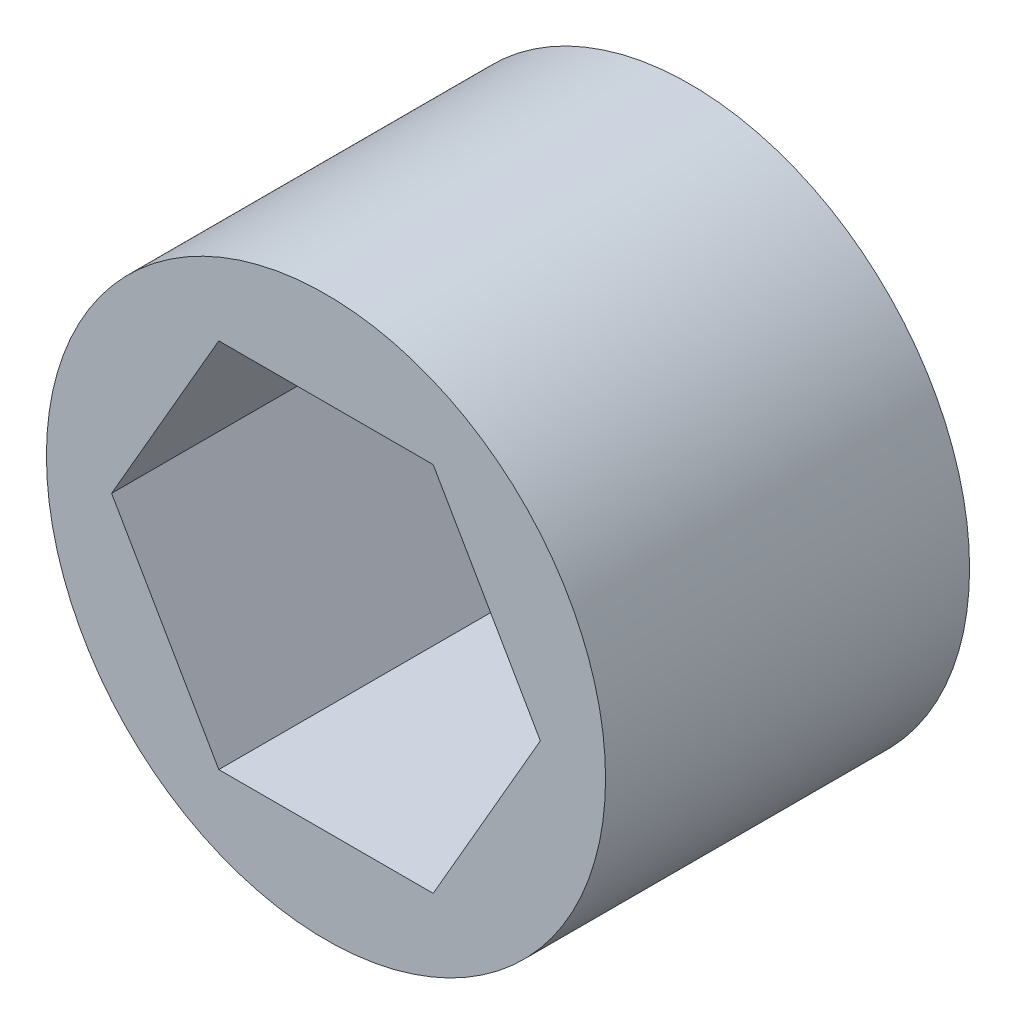
ISO-10303-21;
HEADER;
FILE_DESCRIPTION(('STEP AP214'),'2;1');
FILE_NAME('part.step','',(''),(''),'','','');
FILE_SCHEMA(('AUTOMOTIVE_DESIGN { 1 0 10303 214 1 1 1 1 }'));
ENDSEC;
DATA;
#1=APPLICATION_CONTEXT('core data for automotive mechanical design processes');
#2=APPLICATION_PROTOCOL_DEFINITION('international standard','automotive_design',2000,#1);
#3=PRODUCT_CONTEXT('',#1,'mechanical');
#4=PRODUCT('Part','Part','',(#3));
#5=PRODUCT_RELATED_PRODUCT_CATEGORY('part','',(#4));
#6=PRODUCT_DEFINITION_FORMATION('','',#4);
#7=PRODUCT_DEFINITION_CONTEXT('part definition',#1,'design');
#8=PRODUCT_DEFINITION('design','',#6,#7);
#9=PRODUCT_DEFINITION_SHAPE('','',#8);
#10=(LENGTH_UNIT() NAMED_UNIT(*) SI_UNIT(.MILLI.,.METRE.));
#11=(NAMED_UNIT(*) PLANE_ANGLE_UNIT() SI_UNIT($,.RADIAN.));
#12=(NAMED_UNIT(*) SI_UNIT($,.STERADIAN.) SOLID_ANGLE_UNIT());
#13=UNCERTAINTY_MEASURE_WITH_UNIT(LENGTH_MEASURE(1.E-05),#10,'distance_accuracy_value','');
#14=(GEOMETRIC_REPRESENTATION_CONTEXT(3) GLOBAL_UNCERTAINTY_ASSIGNED_CONTEXT((#13)) GLOBAL_UNIT_ASSIGNED_CONTEXT((#10,
#11,#12)) REPRESENTATION_CONTEXT('',''));
#15=CARTESIAN_POINT('',(0.,0.,0.));
#16=DIRECTION('',(0.,0.,1.));
#17=DIRECTION('',(1.,0.,0.));
#18=AXIS2_PLACEMENT_3D('',#15,#16,#17);
#19=CARTESIAN_POINT('',(0.,0.,6.35));
#20=DIRECTION('',(0.,0.,-1.));
#21=DIRECTION('',(-1.,0.,0.));
#22=AXIS2_PLACEMENT_3D('',#19,#20,#21);
#23=PLANE('',#22);
#24=CARTESIAN_POINT('',(0.,0.,6.35));
#25=DIRECTION('',(0.,0.,1.));
#26=DIRECTION('',(-1.,0.,0.));
#27=AXIS2_PLACEMENT_3D('',#24,#25,#26);
#28=CIRCLE('',#27,9.7536);
#29=CARTESIAN_POINT('',(-9.7536,0.,6.35));
#30=VERTEX_POINT('',#29);
#31=EDGE_CURVE('E11',#30,#30,#28,.T.);
#32=ORIENTED_EDGE('',*,*,#31,.T.);
#33=EDGE_LOOP('',(#32));
#34=FACE_BOUND('',#33,.T.);
#35=DIRECTION('',(-1.,0.,0.));
#36=VECTOR('',#35,1.);
#37=CARTESIAN_POINT('',(3.73949769354121,6.477,6.35));
#38=LINE('',#37,#36);
#39=CARTESIAN_POINT('',(3.73949769354121,6.477,6.35));
#40=VERTEX_POINT('',#39);
#41=CARTESIAN_POINT('',(-3.73949769354121,6.477,6.35));
#42=VERTEX_POINT('',#41);
#43=EDGE_CURVE('E87',#40,#42,#38,.T.);
#44=ORIENTED_EDGE('',*,*,#43,.F.);
#45=DIRECTION('',(-0.5,0.866025403784439,0.));
#46=VECTOR('',#45,1.);
#47=CARTESIAN_POINT('',(7.47899538708241,0.,6.35));
#48=LINE('',#47,#46);
#49=CARTESIAN_POINT('',(7.47899538708241,0.,6.35));
#50=VERTEX_POINT('',#49);
#51=EDGE_CURVE('E115',#50,#40,#48,.T.);
#52=ORIENTED_EDGE('',*,*,#51,.F.);
#53=DIRECTION('',(0.5,0.866025403784439,0.));
#54=VECTOR('',#53,1.);
#55=CARTESIAN_POINT('',(3.73949769354121,-6.477,6.35));
#56=LINE('',#55,#54);
#57=CARTESIAN_POINT('',(3.73949769354121,-6.477,6.35));
#58=VERTEX_POINT('',#57);
#59=EDGE_CURVE('E113',#58,#50,#56,.T.);
#60=ORIENTED_EDGE('',*,*,#59,.F.);
#61=DIRECTION('',(1.,0.,0.));
#62=VECTOR('',#61,1.);
#63=CARTESIAN_POINT('',(-3.7394976935412,-6.477,6.35));
#64=LINE('',#63,#62);
#65=CARTESIAN_POINT('',(-3.7394976935412,-6.477,6.35));
#66=VERTEX_POINT('',#65);
#67=EDGE_CURVE('E109',#66,#58,#64,.T.);
#68=ORIENTED_EDGE('',*,*,#67,.F.);
#69=DIRECTION('',(0.5,-0.866025403784438,0.));
#70=VECTOR('',#69,1.);
#71=CARTESIAN_POINT('',(-7.47899538708241,0.,6.35));
#72=LINE('',#71,#70);
#73=CARTESIAN_POINT('',(-7.47899538708241,0.,6.35));
#74=VERTEX_POINT('',#73);
#75=EDGE_CURVE('E107',#74,#66,#72,.T.);
#76=ORIENTED_EDGE('',*,*,#75,.F.);
#77=DIRECTION('',(-0.5,-0.866025403784439,0.));
#78=VECTOR('',#77,1.);
#79=CARTESIAN_POINT('',(-3.73949769354121,6.477,6.35));
#80=LINE('',#79,#78);
#81=EDGE_CURVE('E95',#42,#74,#80,.T.);
#82=ORIENTED_EDGE('',*,*,#81,.F.);
#83=EDGE_LOOP('',(#44,#52,#60,#68,#76,#82));
#84=FACE_BOUND('',#83,.T.);
#85=ADVANCED_FACE('F34',(#34,#84),#23,.F.);
#86=CARTESIAN_POINT('',(0.,0.,-6.35));
#87=DIRECTION('',(0.,0.,-1.));
#88=DIRECTION('',(-1.,0.,0.));
#89=AXIS2_PLACEMENT_3D('',#86,#87,#88);
#90=PLANE('',#89);
#91=CARTESIAN_POINT('',(0.,0.,-6.35));
#92=DIRECTION('',(0.,0.,1.));
#93=DIRECTION('',(-1.,0.,0.));
#94=AXIS2_PLACEMENT_3D('',#91,#92,#93);
#95=CIRCLE('',#94,9.7536);
#96=CARTESIAN_POINT('',(-9.7536,0.,-6.35));
#97=VERTEX_POINT('',#96);
#98=EDGE_CURVE('E38',#97,#97,#95,.T.);
#99=ORIENTED_EDGE('',*,*,#98,.F.);
#100=EDGE_LOOP('',(#99));
#101=FACE_BOUND('',#100,.T.);
#102=DIRECTION('',(-0.5,0.866025403784439,0.));
#103=VECTOR('',#102,1.);
#104=CARTESIAN_POINT('',(7.47899538708241,0.,-6.35));
#105=LINE('',#104,#103);
#106=CARTESIAN_POINT('',(7.47899538708241,0.,-6.35));
#107=VERTEX_POINT('',#106);
#108=CARTESIAN_POINT('',(3.73949769354121,6.477,-6.35));
#109=VERTEX_POINT('',#108);
#110=EDGE_CURVE('E96',#107,#109,#105,.T.);
#111=ORIENTED_EDGE('',*,*,#110,.T.);
#112=DIRECTION('',(-1.,0.,0.));
#113=VECTOR('',#112,1.);
#114=CARTESIAN_POINT('',(3.73949769354121,6.477,-6.35));
#115=LINE('',#114,#113);
#116=CARTESIAN_POINT('',(-3.73949769354121,6.477,-6.35));
#117=VERTEX_POINT('',#116);
#118=EDGE_CURVE('E57',#109,#117,#115,.T.);
#119=ORIENTED_EDGE('',*,*,#118,.T.);
#120=DIRECTION('',(-0.5,-0.866025403784439,0.));
#121=VECTOR('',#120,1.);
#122=CARTESIAN_POINT('',(-3.73949769354121,6.477,-6.35));
#123=LINE('',#122,#121);
#124=CARTESIAN_POINT('',(-7.47899538708241,0.,-6.35));
#125=VERTEX_POINT('',#124);
#126=EDGE_CURVE('E102',#117,#125,#123,.T.);
#127=ORIENTED_EDGE('',*,*,#126,.T.);
#128=DIRECTION('',(0.5,-0.866025403784438,0.));
#129=VECTOR('',#128,1.);
#130=CARTESIAN_POINT('',(-7.47899538708241,0.,-6.35));
#131=LINE('',#130,#129);
#132=CARTESIAN_POINT('',(-3.7394976935412,-6.477,-6.35));
#133=VERTEX_POINT('',#132);
#134=EDGE_CURVE('E119',#125,#133,#131,.T.);
#135=ORIENTED_EDGE('',*,*,#134,.T.);
#136=DIRECTION('',(1.,0.,0.));
#137=VECTOR('',#136,1.);
#138=CARTESIAN_POINT('',(-3.7394976935412,-6.477,-6.35));
#139=LINE('',#138,#137);
#140=CARTESIAN_POINT('',(3.73949769354121,-6.477,-6.35));
#141=VERTEX_POINT('',#140);
#142=EDGE_CURVE('E122',#133,#141,#139,.T.);
#143=ORIENTED_EDGE('',*,*,#142,.T.);
#144=DIRECTION('',(0.5,0.866025403784439,0.));
#145=VECTOR('',#144,1.);
#146=CARTESIAN_POINT('',(3.73949769354121,-6.477,-6.35));
#147=LINE('',#146,#145);
#148=EDGE_CURVE('E125',#141,#107,#147,.T.);
#149=ORIENTED_EDGE('',*,*,#148,.T.);
#150=EDGE_LOOP('',(#111,#119,#127,#135,#143,#149));
#151=FACE_BOUND('',#150,.T.);
#152=ADVANCED_FACE('F142',(#101,#151),#90,.T.);
#153=CARTESIAN_POINT('',(0.,0.,6.35));
#154=DIRECTION('',(0.,0.,-1.));
#155=DIRECTION('',(-1.,0.,0.));
#156=AXIS2_PLACEMENT_3D('',#153,#154,#155);
#157=CYLINDRICAL_SURFACE('',#156,9.7536);
#158=ORIENTED_EDGE('',*,*,#31,.F.);
#159=EDGE_LOOP('',(#158));
#160=FACE_BOUND('',#159,.T.);
#161=ORIENTED_EDGE('',*,*,#98,.T.);
#162=EDGE_LOOP('',(#161));
#163=FACE_BOUND('',#162,.T.);
#164=ADVANCED_FACE('F36',(#160,#163),#157,.T.);
#165=CARTESIAN_POINT('',(3.73949769354121,6.477,6.35));
#166=DIRECTION('',(0.,-1.,0.));
#167=DIRECTION('',(1.,0.,0.));
#168=AXIS2_PLACEMENT_3D('',#165,#166,#167);
#169=PLANE('',#168);
#170=ORIENTED_EDGE('',*,*,#118,.F.);
#171=DIRECTION('',(0.,0.,-1.));
#172=VECTOR('',#171,1.);
#173=CARTESIAN_POINT('',(3.73949769354121,6.477,6.35));
#174=LINE('',#173,#172);
#175=EDGE_CURVE('E91',#40,#109,#174,.T.);
#176=ORIENTED_EDGE('',*,*,#175,.F.);
#177=ORIENTED_EDGE('',*,*,#43,.T.);
#178=DIRECTION('',(0.,0.,-1.));
#179=VECTOR('',#178,1.);
#180=CARTESIAN_POINT('',(-3.73949769354121,6.477,6.35));
#181=LINE('',#180,#179);
#182=EDGE_CURVE('E90',#42,#117,#181,.T.);
#183=ORIENTED_EDGE('',*,*,#182,.T.);
#184=EDGE_LOOP('',(#170,#176,#177,#183));
#185=FACE_BOUND('',#184,.T.);
#186=ADVANCED_FACE('F89',(#185),#169,.T.);
#187=CARTESIAN_POINT('',(-3.73949769354121,6.477,6.35));
#188=DIRECTION('',(0.866025403784439,-0.5,0.));
#189=DIRECTION('',(0.5,0.866025403784439,0.));
#190=AXIS2_PLACEMENT_3D('',#187,#188,#189);
#191=PLANE('',#190);
#192=ORIENTED_EDGE('',*,*,#126,.F.);
#193=ORIENTED_EDGE('',*,*,#182,.F.);
#194=ORIENTED_EDGE('',*,*,#81,.T.);
#195=DIRECTION('',(0.,0.,-1.));
#196=VECTOR('',#195,1.);
#197=CARTESIAN_POINT('',(-7.47899538708241,0.,6.35));
#198=LINE('',#197,#196);
#199=EDGE_CURVE('E103',#74,#125,#198,.T.);
#200=ORIENTED_EDGE('',*,*,#199,.T.);
#201=EDGE_LOOP('',(#192,#193,#194,#200));
#202=FACE_BOUND('',#201,.T.);
#203=ADVANCED_FACE('F99',(#202),#191,.T.);
#204=CARTESIAN_POINT('',(-7.47899538708241,0.,6.35));
#205=DIRECTION('',(0.866025403784438,0.5,0.));
#206=DIRECTION('',(-0.5,0.866025403784439,0.));
#207=AXIS2_PLACEMENT_3D('',#204,#205,#206);
#208=PLANE('',#207);
#209=ORIENTED_EDGE('',*,*,#134,.F.);
#210=ORIENTED_EDGE('',*,*,#199,.F.);
#211=ORIENTED_EDGE('',*,*,#75,.T.);
#212=DIRECTION('',(0.,0.,-1.));
#213=VECTOR('',#212,1.);
#214=CARTESIAN_POINT('',(-3.7394976935412,-6.477,6.35));
#215=LINE('',#214,#213);
#216=EDGE_CURVE('E134',#66,#133,#215,.T.);
#217=ORIENTED_EDGE('',*,*,#216,.T.);
#218=EDGE_LOOP('',(#209,#210,#211,#217));
#219=FACE_BOUND('',#218,.T.);
#220=ADVANCED_FACE('F138',(#219),#208,.T.);
#221=CARTESIAN_POINT('',(-3.7394976935412,-6.477,6.35));
#222=DIRECTION('',(0.,1.,0.));
#223=DIRECTION('',(-1.,0.,0.));
#224=AXIS2_PLACEMENT_3D('',#221,#222,#223);
#225=PLANE('',#224);
#226=ORIENTED_EDGE('',*,*,#142,.F.);
#227=ORIENTED_EDGE('',*,*,#216,.F.);
#228=ORIENTED_EDGE('',*,*,#67,.T.);
#229=DIRECTION('',(0.,0.,-1.));
#230=VECTOR('',#229,1.);
#231=CARTESIAN_POINT('',(3.73949769354121,-6.477,6.35));
#232=LINE('',#231,#230);
#233=EDGE_CURVE('E132',#58,#141,#232,.T.);
#234=ORIENTED_EDGE('',*,*,#233,.T.);
#235=EDGE_LOOP('',(#226,#227,#228,#234));
#236=FACE_BOUND('',#235,.T.);
#237=ADVANCED_FACE('F150',(#236),#225,.T.);
#238=CARTESIAN_POINT('',(3.73949769354121,-6.477,6.35));
#239=DIRECTION('',(-0.866025403784439,0.5,0.));
#240=DIRECTION('',(-0.5,-0.866025403784439,0.));
#241=AXIS2_PLACEMENT_3D('',#238,#239,#240);
#242=PLANE('',#241);
#243=ORIENTED_EDGE('',*,*,#148,.F.);
#244=ORIENTED_EDGE('',*,*,#233,.F.);
#245=ORIENTED_EDGE('',*,*,#59,.T.);
#246=DIRECTION('',(0.,0.,-1.));
#247=VECTOR('',#246,1.);
#248=CARTESIAN_POINT('',(7.47899538708241,0.,6.35));
#249=LINE('',#248,#247);
#250=EDGE_CURVE('E49',#50,#107,#249,.T.);
#251=ORIENTED_EDGE('',*,*,#250,.T.);
#252=EDGE_LOOP('',(#243,#244,#245,#251));
#253=FACE_BOUND('',#252,.T.);
#254=ADVANCED_FACE('F148',(#253),#242,.T.);
#255=CARTESIAN_POINT('',(7.47899538708241,0.,6.35));
#256=DIRECTION('',(-0.866025403784439,-0.5,0.));
#257=DIRECTION('',(0.5,-0.866025403784439,0.));
#258=AXIS2_PLACEMENT_3D('',#255,#256,#257);
#259=PLANE('',#258);
#260=ORIENTED_EDGE('',*,*,#110,.F.);
#261=ORIENTED_EDGE('',*,*,#250,.F.);
#262=ORIENTED_EDGE('',*,*,#51,.T.);
#263=ORIENTED_EDGE('',*,*,#175,.T.);
#264=EDGE_LOOP('',(#260,#261,#262,#263));
#265=FACE_BOUND('',#264,.T.);
#266=ADVANCED_FACE('F144',(#265),#259,.T.);
#267=CLOSED_SHELL('',(#85,#152,#164,#186,#203,#220,#237,#254,#266));
#268=MANIFOLD_SOLID_BREP('B2',#267);
#269=ADVANCED_BREP_SHAPE_REPRESENTATION('',(#18,#268),#14);
#270=SHAPE_DEFINITION_REPRESENTATION(#9,#269);
ENDSEC;
END-ISO-10303-21;
